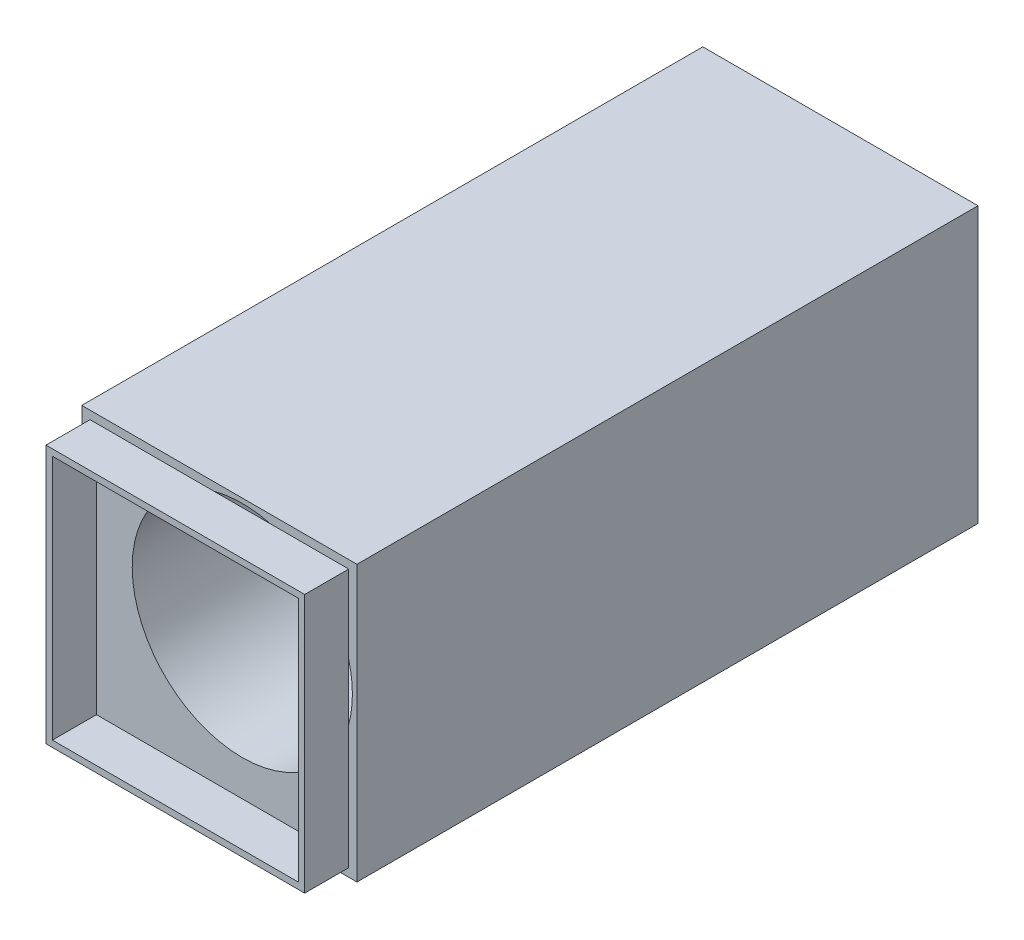
ISO-10303-21;
HEADER;
FILE_DESCRIPTION(('STEP AP214'),'2;1');
FILE_NAME('part.step','',(''),(''),'','','');
FILE_SCHEMA(('AUTOMOTIVE_DESIGN { 1 0 10303 214 1 1 1 1 }'));
ENDSEC;
DATA;
#1=APPLICATION_CONTEXT('core data for automotive mechanical design processes');
#2=APPLICATION_PROTOCOL_DEFINITION('international standard','automotive_design',2000,#1);
#3=PRODUCT_CONTEXT('',#1,'mechanical');
#4=PRODUCT('Part','Part','',(#3));
#5=PRODUCT_RELATED_PRODUCT_CATEGORY('part','',(#4));
#6=PRODUCT_DEFINITION_FORMATION('','',#4);
#7=PRODUCT_DEFINITION_CONTEXT('part definition',#1,'design');
#8=PRODUCT_DEFINITION('design','',#6,#7);
#9=PRODUCT_DEFINITION_SHAPE('','',#8);
#10=(LENGTH_UNIT() NAMED_UNIT(*) SI_UNIT(.MILLI.,.METRE.));
#11=(NAMED_UNIT(*) PLANE_ANGLE_UNIT() SI_UNIT($,.RADIAN.));
#12=(NAMED_UNIT(*) SI_UNIT($,.STERADIAN.) SOLID_ANGLE_UNIT());
#13=UNCERTAINTY_MEASURE_WITH_UNIT(LENGTH_MEASURE(1.E-05),#10,'distance_accuracy_value','');
#14=(GEOMETRIC_REPRESENTATION_CONTEXT(3) GLOBAL_UNCERTAINTY_ASSIGNED_CONTEXT((#13)) GLOBAL_UNIT_ASSIGNED_CONTEXT((#10,
#11,#12)) REPRESENTATION_CONTEXT('',''));
#15=CARTESIAN_POINT('',(0.,0.,0.));
#16=DIRECTION('',(0.,0.,1.));
#17=DIRECTION('',(1.,0.,0.));
#18=AXIS2_PLACEMENT_3D('',#15,#16,#17);
#19=CARTESIAN_POINT('',(0.,0.,-12.192));
#20=DIRECTION('',(0.,0.,1.));
#21=DIRECTION('',(1.,0.,0.));
#22=AXIS2_PLACEMENT_3D('',#19,#20,#21);
#23=PLANE('',#22);
#24=CARTESIAN_POINT('',(44.45,44.45,-12.192));
#25=DIRECTION('',(0.,0.,1.));
#26=DIRECTION('',(1.,0.,0.));
#27=AXIS2_PLACEMENT_3D('',#24,#25,#26);
#28=CIRCLE('',#27,30.48);
#29=CARTESIAN_POINT('',(72.136,57.1981686527908,-12.192));
#30=VERTEX_POINT('',#29);
#31=CARTESIAN_POINT('',(57.1981686527908,72.136,-12.192));
#32=VERTEX_POINT('',#31);
#33=EDGE_CURVE('E183',#30,#32,#28,.T.);
#34=ORIENTED_EDGE('',*,*,#33,.F.);
#35=DIRECTION('',(0.,-1.,0.));
#36=VECTOR('',#35,1.);
#37=CARTESIAN_POINT('',(72.136,0.,-12.192));
#38=LINE('',#37,#36);
#39=CARTESIAN_POINT('',(72.136,72.136,-12.192));
#40=VERTEX_POINT('',#39);
#41=EDGE_CURVE('E257',#40,#30,#38,.T.);
#42=ORIENTED_EDGE('',*,*,#41,.F.);
#43=DIRECTION('',(1.,0.,0.));
#44=VECTOR('',#43,1.);
#45=CARTESIAN_POINT('',(0.,72.136,-12.192));
#46=LINE('',#45,#44);
#47=EDGE_CURVE('E255',#32,#40,#46,.T.);
#48=ORIENTED_EDGE('',*,*,#47,.F.);
#49=EDGE_LOOP('',(#34,#42,#48));
#50=FACE_BOUND('',#49,.T.);
#51=ADVANCED_FACE('F57',(#50),#23,.T.);
#52=CARTESIAN_POINT('',(0.,0.,-184.15));
#53=DIRECTION('',(-1.,0.,0.));
#54=DIRECTION('',(0.,0.,1.));
#55=AXIS2_PLACEMENT_3D('',#52,#53,#54);
#56=PLANE('',#55);
#57=DIRECTION('',(0.,0.,1.));
#58=VECTOR('',#57,1.);
#59=CARTESIAN_POINT('',(0.,0.,-184.15));
#60=LINE('',#59,#58);
#61=CARTESIAN_POINT('',(0.,0.,-184.15));
#62=VERTEX_POINT('',#61);
#63=CARTESIAN_POINT('',(0.,0.,-12.192));
#64=VERTEX_POINT('',#63);
#65=EDGE_CURVE('E492',#62,#64,#60,.T.);
#66=ORIENTED_EDGE('',*,*,#65,.T.);
#67=DIRECTION('',(0.,-1.,0.));
#68=VECTOR('',#67,1.);
#69=CARTESIAN_POINT('',(0.,0.,-12.192));
#70=LINE('',#69,#68);
#71=CARTESIAN_POINT('',(0.,76.2,-12.192));
#72=VERTEX_POINT('',#71);
#73=EDGE_CURVE('E216',#72,#64,#70,.T.);
#74=ORIENTED_EDGE('',*,*,#73,.F.);
#75=DIRECTION('',(0.,0.,1.));
#76=VECTOR('',#75,1.);
#77=CARTESIAN_POINT('',(0.,76.2,-184.15));
#78=LINE('',#77,#76);
#79=CARTESIAN_POINT('',(0.,76.2,-184.15));
#80=VERTEX_POINT('',#79);
#81=EDGE_CURVE('E175',#80,#72,#78,.T.);
#82=ORIENTED_EDGE('',*,*,#81,.F.);
#83=DIRECTION('',(0.,-1.,0.));
#84=VECTOR('',#83,1.);
#85=CARTESIAN_POINT('',(0.,0.,-184.15));
#86=LINE('',#85,#84);
#87=EDGE_CURVE('E479',#80,#62,#86,.T.);
#88=ORIENTED_EDGE('',*,*,#87,.T.);
#89=EDGE_LOOP('',(#66,#74,#82,#88));
#90=FACE_BOUND('',#89,.T.);
#91=ADVANCED_FACE('F59',(#90),#56,.T.);
#92=CARTESIAN_POINT('',(0.,76.2,-184.15));
#93=DIRECTION('',(0.,1.,0.));
#94=DIRECTION('',(0.,0.,1.));
#95=AXIS2_PLACEMENT_3D('',#92,#93,#94);
#96=PLANE('',#95);
#97=ORIENTED_EDGE('',*,*,#81,.T.);
#98=DIRECTION('',(-1.,0.,0.));
#99=VECTOR('',#98,1.);
#100=CARTESIAN_POINT('',(0.,76.2,-12.192));
#101=LINE('',#100,#99);
#102=CARTESIAN_POINT('',(76.2,76.2,-12.192));
#103=VERTEX_POINT('',#102);
#104=EDGE_CURVE('E220',#103,#72,#101,.T.);
#105=ORIENTED_EDGE('',*,*,#104,.F.);
#106=DIRECTION('',(0.,0.,1.));
#107=VECTOR('',#106,1.);
#108=CARTESIAN_POINT('',(76.2,76.2,-184.15));
#109=LINE('',#108,#107);
#110=CARTESIAN_POINT('',(76.2,76.2,-184.15));
#111=VERTEX_POINT('',#110);
#112=EDGE_CURVE('E490',#111,#103,#109,.T.);
#113=ORIENTED_EDGE('',*,*,#112,.F.);
#114=DIRECTION('',(-1.,0.,0.));
#115=VECTOR('',#114,1.);
#116=CARTESIAN_POINT('',(0.,76.2,-184.15));
#117=LINE('',#116,#115);
#118=EDGE_CURVE('E482',#111,#80,#117,.T.);
#119=ORIENTED_EDGE('',*,*,#118,.T.);
#120=EDGE_LOOP('',(#97,#105,#113,#119));
#121=FACE_BOUND('',#120,.T.);
#122=ADVANCED_FACE('F304',(#121),#96,.T.);
#123=CARTESIAN_POINT('',(76.2,0.,-184.15));
#124=DIRECTION('',(1.,0.,0.));
#125=DIRECTION('',(0.,0.,-1.));
#126=AXIS2_PLACEMENT_3D('',#123,#124,#125);
#127=PLANE('',#126);
#128=ORIENTED_EDGE('',*,*,#112,.T.);
#129=DIRECTION('',(0.,1.,0.));
#130=VECTOR('',#129,1.);
#131=CARTESIAN_POINT('',(76.2,0.,-12.192));
#132=LINE('',#131,#130);
#133=CARTESIAN_POINT('',(76.2,0.,-12.192));
#134=VERTEX_POINT('',#133);
#135=EDGE_CURVE('E212',#134,#103,#132,.T.);
#136=ORIENTED_EDGE('',*,*,#135,.F.);
#137=DIRECTION('',(0.,0.,1.));
#138=VECTOR('',#137,1.);
#139=CARTESIAN_POINT('',(76.2,0.,-184.15));
#140=LINE('',#139,#138);
#141=CARTESIAN_POINT('',(76.2,0.,-184.15));
#142=VERTEX_POINT('',#141);
#143=EDGE_CURVE('E495',#142,#134,#140,.T.);
#144=ORIENTED_EDGE('',*,*,#143,.F.);
#145=DIRECTION('',(0.,1.,0.));
#146=VECTOR('',#145,1.);
#147=CARTESIAN_POINT('',(76.2,0.,-184.15));
#148=LINE('',#147,#146);
#149=EDGE_CURVE('E493',#142,#111,#148,.T.);
#150=ORIENTED_EDGE('',*,*,#149,.T.);
#151=EDGE_LOOP('',(#128,#136,#144,#150));
#152=FACE_BOUND('',#151,.T.);
#153=ADVANCED_FACE('F441',(#152),#127,.T.);
#154=CARTESIAN_POINT('',(0.,0.,-184.15));
#155=DIRECTION('',(0.,-1.,0.));
#156=DIRECTION('',(0.,0.,-1.));
#157=AXIS2_PLACEMENT_3D('',#154,#155,#156);
#158=PLANE('',#157);
#159=ORIENTED_EDGE('',*,*,#143,.T.);
#160=DIRECTION('',(1.,0.,0.));
#161=VECTOR('',#160,1.);
#162=CARTESIAN_POINT('',(0.,0.,-12.192));
#163=LINE('',#162,#161);
#164=EDGE_CURVE('E213',#64,#134,#163,.T.);
#165=ORIENTED_EDGE('',*,*,#164,.F.);
#166=ORIENTED_EDGE('',*,*,#65,.F.);
#167=DIRECTION('',(1.,0.,0.));
#168=VECTOR('',#167,1.);
#169=CARTESIAN_POINT('',(0.,0.,-184.15));
#170=LINE('',#169,#168);
#171=EDGE_CURVE('E484',#62,#142,#170,.T.);
#172=ORIENTED_EDGE('',*,*,#171,.T.);
#173=EDGE_LOOP('',(#159,#165,#166,#172));
#174=FACE_BOUND('',#173,.T.);
#175=ADVANCED_FACE('F437',(#174),#158,.T.);
#176=CARTESIAN_POINT('',(0.,0.,-184.15));
#177=DIRECTION('',(0.,0.,-1.));
#178=DIRECTION('',(-1.,0.,0.));
#179=AXIS2_PLACEMENT_3D('',#176,#177,#178);
#180=PLANE('',#179);
#181=ORIENTED_EDGE('',*,*,#87,.F.);
#182=ORIENTED_EDGE('',*,*,#118,.F.);
#183=ORIENTED_EDGE('',*,*,#149,.F.);
#184=ORIENTED_EDGE('',*,*,#171,.F.);
#185=EDGE_LOOP('',(#181,#182,#183,#184));
#186=FACE_BOUND('',#185,.T.);
#187=ADVANCED_FACE('F391',(#186),#180,.T.);
#188=CARTESIAN_POINT('',(0.,73.914,-12.192));
#189=DIRECTION('',(0.,-1.,0.));
#190=DIRECTION('',(0.,0.,-1.));
#191=AXIS2_PLACEMENT_3D('',#188,#189,#190);
#192=PLANE('',#191);
#193=DIRECTION('',(1.,0.,0.));
#194=VECTOR('',#193,1.);
#195=CARTESIAN_POINT('',(0.,73.914,0.));
#196=LINE('',#195,#194);
#197=CARTESIAN_POINT('',(2.286,73.914,0.));
#198=VERTEX_POINT('',#197);
#199=CARTESIAN_POINT('',(73.914,73.914,0.));
#200=VERTEX_POINT('',#199);
#201=EDGE_CURVE('E233',#198,#200,#196,.T.);
#202=ORIENTED_EDGE('',*,*,#201,.T.);
#203=DIRECTION('',(0.,0.,1.));
#204=VECTOR('',#203,1.);
#205=CARTESIAN_POINT('',(73.914,73.914,-12.192));
#206=LINE('',#205,#204);
#207=CARTESIAN_POINT('',(73.914,73.914,-12.192));
#208=VERTEX_POINT('',#207);
#209=EDGE_CURVE('E504',#208,#200,#206,.T.);
#210=ORIENTED_EDGE('',*,*,#209,.F.);
#211=DIRECTION('',(1.,0.,0.));
#212=VECTOR('',#211,1.);
#213=CARTESIAN_POINT('',(0.,73.914,-12.192));
#214=LINE('',#213,#212);
#215=CARTESIAN_POINT('',(52.2540440798344,73.914,-12.192));
#216=VERTEX_POINT('',#215);
#217=EDGE_CURVE('E198',#216,#208,#214,.T.);
#218=ORIENTED_EDGE('',*,*,#217,.F.);
#219=CARTESIAN_POINT('',(36.6459559201656,73.914,-12.192));
#220=VERTEX_POINT('',#219);
#221=EDGE_CURVE('E207',#220,#216,#214,.T.);
#222=ORIENTED_EDGE('',*,*,#221,.F.);
#223=CARTESIAN_POINT('',(2.286,73.914,-12.192));
#224=VERTEX_POINT('',#223);
#225=EDGE_CURVE('E205',#224,#220,#214,.T.);
#226=ORIENTED_EDGE('',*,*,#225,.F.);
#227=DIRECTION('',(0.,0.,1.));
#228=VECTOR('',#227,1.);
#229=CARTESIAN_POINT('',(2.286,73.914,-12.192));
#230=LINE('',#229,#228);
#231=EDGE_CURVE('E486',#224,#198,#230,.T.);
#232=ORIENTED_EDGE('',*,*,#231,.T.);
#233=EDGE_LOOP('',(#202,#210,#218,#222,#226,#232));
#234=FACE_BOUND('',#233,.T.);
#235=ADVANCED_FACE('F386',(#234),#192,.F.);
#236=CARTESIAN_POINT('',(2.28600000000001,0.,-12.192));
#237=DIRECTION('',(-1.,0.,0.));
#238=DIRECTION('',(0.,-1.,0.));
#239=AXIS2_PLACEMENT_3D('',#236,#237,#238);
#240=PLANE('',#239);
#241=DIRECTION('',(0.,-1.,0.));
#242=VECTOR('',#241,1.);
#243=CARTESIAN_POINT('',(2.28600000000001,0.,0.));
#244=LINE('',#243,#242);
#245=CARTESIAN_POINT('',(2.28600000000001,2.286,0.));
#246=VERTEX_POINT('',#245);
#247=EDGE_CURVE('E222',#198,#246,#244,.T.);
#248=ORIENTED_EDGE('',*,*,#247,.F.);
#249=ORIENTED_EDGE('',*,*,#231,.F.);
#250=DIRECTION('',(0.,-1.,0.));
#251=VECTOR('',#250,1.);
#252=CARTESIAN_POINT('',(2.28600000000001,0.,-12.192));
#253=LINE('',#252,#251);
#254=CARTESIAN_POINT('',(2.28600000000001,2.286,-12.192));
#255=VERTEX_POINT('',#254);
#256=EDGE_CURVE('E202',#224,#255,#253,.T.);
#257=ORIENTED_EDGE('',*,*,#256,.T.);
#258=DIRECTION('',(0.,0.,1.));
#259=VECTOR('',#258,1.);
#260=CARTESIAN_POINT('',(2.28600000000001,2.286,-12.192));
#261=LINE('',#260,#259);
#262=EDGE_CURVE('E508',#255,#246,#261,.T.);
#263=ORIENTED_EDGE('',*,*,#262,.T.);
#264=EDGE_LOOP('',(#248,#249,#257,#263));
#265=FACE_BOUND('',#264,.T.);
#266=ADVANCED_FACE('F390',(#265),#240,.T.);
#267=CARTESIAN_POINT('',(0.,2.286,-12.192));
#268=DIRECTION('',(0.,-1.,0.));
#269=DIRECTION('',(1.,0.,0.));
#270=AXIS2_PLACEMENT_3D('',#267,#268,#269);
#271=PLANE('',#270);
#272=DIRECTION('',(1.,0.,0.));
#273=VECTOR('',#272,1.);
#274=CARTESIAN_POINT('',(0.,2.286,0.));
#275=LINE('',#274,#273);
#276=CARTESIAN_POINT('',(73.914,2.286,0.));
#277=VERTEX_POINT('',#276);
#278=EDGE_CURVE('E514',#246,#277,#275,.T.);
#279=ORIENTED_EDGE('',*,*,#278,.F.);
#280=ORIENTED_EDGE('',*,*,#262,.F.);
#281=DIRECTION('',(1.,0.,0.));
#282=VECTOR('',#281,1.);
#283=CARTESIAN_POINT('',(0.,2.286,-12.192));
#284=LINE('',#283,#282);
#285=CARTESIAN_POINT('',(73.914,2.286,-12.192));
#286=VERTEX_POINT('',#285);
#287=EDGE_CURVE('E200',#255,#286,#284,.T.);
#288=ORIENTED_EDGE('',*,*,#287,.T.);
#289=DIRECTION('',(0.,0.,1.));
#290=VECTOR('',#289,1.);
#291=CARTESIAN_POINT('',(73.914,2.286,-12.192));
#292=LINE('',#291,#290);
#293=EDGE_CURVE('E506',#286,#277,#292,.T.);
#294=ORIENTED_EDGE('',*,*,#293,.T.);
#295=EDGE_LOOP('',(#279,#280,#288,#294));
#296=FACE_BOUND('',#295,.T.);
#297=ADVANCED_FACE('F379',(#296),#271,.T.);
#298=CARTESIAN_POINT('',(73.914,0.,-12.192));
#299=DIRECTION('',(-1.,0.,0.));
#300=DIRECTION('',(0.,-1.,0.));
#301=AXIS2_PLACEMENT_3D('',#298,#299,#300);
#302=PLANE('',#301);
#303=DIRECTION('',(0.,-1.,0.));
#304=VECTOR('',#303,1.);
#305=CARTESIAN_POINT('',(73.914,0.,0.));
#306=LINE('',#305,#304);
#307=EDGE_CURVE('E517',#200,#277,#306,.T.);
#308=ORIENTED_EDGE('',*,*,#307,.T.);
#309=ORIENTED_EDGE('',*,*,#293,.F.);
#310=DIRECTION('',(0.,-1.,0.));
#311=VECTOR('',#310,1.);
#312=CARTESIAN_POINT('',(73.914,0.,-12.192));
#313=LINE('',#312,#311);
#314=CARTESIAN_POINT('',(73.914,36.6459559201656,-12.192));
#315=VERTEX_POINT('',#314);
#316=EDGE_CURVE('E192',#315,#286,#313,.T.);
#317=ORIENTED_EDGE('',*,*,#316,.F.);
#318=CARTESIAN_POINT('',(73.914,52.2540440798344,-12.192));
#319=VERTEX_POINT('',#318);
#320=EDGE_CURVE('E179',#319,#315,#313,.T.);
#321=ORIENTED_EDGE('',*,*,#320,.F.);
#322=EDGE_CURVE('E190',#208,#319,#313,.T.);
#323=ORIENTED_EDGE('',*,*,#322,.F.);
#324=ORIENTED_EDGE('',*,*,#209,.T.);
#325=EDGE_LOOP('',(#308,#309,#317,#321,#323,#324));
#326=FACE_BOUND('',#325,.T.);
#327=ADVANCED_FACE('F188',(#326),#302,.F.);
#328=CARTESIAN_POINT('',(0.,0.,-12.192));
#329=DIRECTION('',(0.,0.,1.));
#330=DIRECTION('',(1.,0.,0.));
#331=AXIS2_PLACEMENT_3D('',#328,#329,#330);
#332=PLANE('',#331);
#333=CARTESIAN_POINT('',(44.45,44.45,-12.192));
#334=DIRECTION('',(0.,0.,1.));
#335=DIRECTION('',(1.,0.,0.));
#336=AXIS2_PLACEMENT_3D('',#333,#334,#335);
#337=CIRCLE('',#336,30.48);
#338=EDGE_CURVE('E12',#216,#220,#337,.T.);
#339=ORIENTED_EDGE('',*,*,#338,.F.);
#340=ORIENTED_EDGE('',*,*,#217,.T.);
#341=ORIENTED_EDGE('',*,*,#322,.T.);
#342=EDGE_CURVE('E61',#315,#319,#337,.T.);
#343=ORIENTED_EDGE('',*,*,#342,.F.);
#344=ORIENTED_EDGE('',*,*,#316,.T.);
#345=ORIENTED_EDGE('',*,*,#287,.F.);
#346=ORIENTED_EDGE('',*,*,#256,.F.);
#347=ORIENTED_EDGE('',*,*,#225,.T.);
#348=EDGE_LOOP('',(#339,#340,#341,#343,#344,#345,#346,#347));
#349=FACE_BOUND('',#348,.T.);
#350=ORIENTED_EDGE('',*,*,#104,.T.);
#351=ORIENTED_EDGE('',*,*,#73,.T.);
#352=ORIENTED_EDGE('',*,*,#164,.T.);
#353=ORIENTED_EDGE('',*,*,#135,.T.);
#354=EDGE_LOOP('',(#350,#351,#352,#353));
#355=FACE_BOUND('',#354,.T.);
#356=ADVANCED_FACE('F195',(#349,#355),#332,.T.);
#357=CARTESIAN_POINT('',(0.,0.,0.));
#358=DIRECTION('',(0.,0.,-1.));
#359=DIRECTION('',(-1.,0.,0.));
#360=AXIS2_PLACEMENT_3D('',#357,#358,#359);
#361=PLANE('',#360);
#362=ORIENTED_EDGE('',*,*,#307,.F.);
#363=ORIENTED_EDGE('',*,*,#201,.F.);
#364=ORIENTED_EDGE('',*,*,#247,.T.);
#365=ORIENTED_EDGE('',*,*,#278,.T.);
#366=EDGE_LOOP('',(#362,#363,#364,#365));
#367=FACE_BOUND('',#366,.T.);
#368=DIRECTION('',(0.,-1.,0.));
#369=VECTOR('',#368,1.);
#370=CARTESIAN_POINT('',(72.136,0.,0.));
#371=LINE('',#370,#369);
#372=CARTESIAN_POINT('',(72.136,72.136,0.));
#373=VERTEX_POINT('',#372);
#374=CARTESIAN_POINT('',(72.136,4.064,0.));
#375=VERTEX_POINT('',#374);
#376=EDGE_CURVE('E244',#373,#375,#371,.T.);
#377=ORIENTED_EDGE('',*,*,#376,.T.);
#378=DIRECTION('',(1.,0.,0.));
#379=VECTOR('',#378,1.);
#380=CARTESIAN_POINT('',(0.,4.064,0.));
#381=LINE('',#380,#379);
#382=CARTESIAN_POINT('',(4.06400000000001,4.064,0.));
#383=VERTEX_POINT('',#382);
#384=EDGE_CURVE('E234',#383,#375,#381,.T.);
#385=ORIENTED_EDGE('',*,*,#384,.F.);
#386=DIRECTION('',(0.,-1.,0.));
#387=VECTOR('',#386,1.);
#388=CARTESIAN_POINT('',(4.06400000000001,0.,0.));
#389=LINE('',#388,#387);
#390=CARTESIAN_POINT('',(4.064,72.136,0.));
#391=VERTEX_POINT('',#390);
#392=EDGE_CURVE('E238',#391,#383,#389,.T.);
#393=ORIENTED_EDGE('',*,*,#392,.F.);
#394=DIRECTION('',(1.,0.,0.));
#395=VECTOR('',#394,1.);
#396=CARTESIAN_POINT('',(0.,72.136,0.));
#397=LINE('',#396,#395);
#398=EDGE_CURVE('E241',#391,#373,#397,.T.);
#399=ORIENTED_EDGE('',*,*,#398,.T.);
#400=EDGE_LOOP('',(#377,#385,#393,#399));
#401=FACE_BOUND('',#400,.T.);
#402=ADVANCED_FACE('F287',(#367,#401),#361,.F.);
#403=CARTESIAN_POINT('',(72.136,0.,-12.192));
#404=DIRECTION('',(-1.,0.,0.));
#405=DIRECTION('',(0.,-1.,0.));
#406=AXIS2_PLACEMENT_3D('',#403,#404,#405);
#407=PLANE('',#406);
#408=ORIENTED_EDGE('',*,*,#376,.F.);
#409=DIRECTION('',(0.,0.,1.));
#410=VECTOR('',#409,1.);
#411=CARTESIAN_POINT('',(72.136,72.136,-12.192));
#412=LINE('',#411,#410);
#413=EDGE_CURVE('E223',#40,#373,#412,.T.);
#414=ORIENTED_EDGE('',*,*,#413,.F.);
#415=ORIENTED_EDGE('',*,*,#41,.T.);
#416=CARTESIAN_POINT('',(72.136,31.7018313472092,-12.192));
#417=VERTEX_POINT('',#416);
#418=EDGE_CURVE('E181',#30,#417,#38,.T.);
#419=ORIENTED_EDGE('',*,*,#418,.T.);
#420=CARTESIAN_POINT('',(72.136,4.064,-12.192));
#421=VERTEX_POINT('',#420);
#422=EDGE_CURVE('E237',#417,#421,#38,.T.);
#423=ORIENTED_EDGE('',*,*,#422,.T.);
#424=DIRECTION('',(0.,0.,1.));
#425=VECTOR('',#424,1.);
#426=CARTESIAN_POINT('',(72.136,4.064,-12.192));
#427=LINE('',#426,#425);
#428=EDGE_CURVE('E231',#421,#375,#427,.T.);
#429=ORIENTED_EDGE('',*,*,#428,.T.);
#430=EDGE_LOOP('',(#408,#414,#415,#419,#423,#429));
#431=FACE_BOUND('',#430,.T.);
#432=ADVANCED_FACE('F272',(#431),#407,.T.);
#433=CARTESIAN_POINT('',(0.,4.064,-12.192));
#434=DIRECTION('',(0.,-1.,0.));
#435=DIRECTION('',(1.,0.,0.));
#436=AXIS2_PLACEMENT_3D('',#433,#434,#435);
#437=PLANE('',#436);
#438=ORIENTED_EDGE('',*,*,#384,.T.);
#439=ORIENTED_EDGE('',*,*,#428,.F.);
#440=DIRECTION('',(1.,0.,0.));
#441=VECTOR('',#440,1.);
#442=CARTESIAN_POINT('',(0.,4.064,-12.192));
#443=LINE('',#442,#441);
#444=CARTESIAN_POINT('',(4.06400000000001,4.064,-12.192));
#445=VERTEX_POINT('',#444);
#446=EDGE_CURVE('E227',#445,#421,#443,.T.);
#447=ORIENTED_EDGE('',*,*,#446,.F.);
#448=DIRECTION('',(0.,0.,1.));
#449=VECTOR('',#448,1.);
#450=CARTESIAN_POINT('',(4.06400000000001,4.064,-12.192));
#451=LINE('',#450,#449);
#452=EDGE_CURVE('E229',#445,#383,#451,.T.);
#453=ORIENTED_EDGE('',*,*,#452,.T.);
#454=EDGE_LOOP('',(#438,#439,#447,#453));
#455=FACE_BOUND('',#454,.T.);
#456=ADVANCED_FACE('F283',(#455),#437,.F.);
#457=CARTESIAN_POINT('',(4.06400000000001,0.,-12.192));
#458=DIRECTION('',(-1.,0.,0.));
#459=DIRECTION('',(0.,-1.,0.));
#460=AXIS2_PLACEMENT_3D('',#457,#458,#459);
#461=PLANE('',#460);
#462=ORIENTED_EDGE('',*,*,#392,.T.);
#463=ORIENTED_EDGE('',*,*,#452,.F.);
#464=DIRECTION('',(0.,-1.,0.));
#465=VECTOR('',#464,1.);
#466=CARTESIAN_POINT('',(4.06400000000001,0.,-12.192));
#467=LINE('',#466,#465);
#468=CARTESIAN_POINT('',(4.064,72.136,-12.192));
#469=VERTEX_POINT('',#468);
#470=EDGE_CURVE('E249',#469,#445,#467,.T.);
#471=ORIENTED_EDGE('',*,*,#470,.F.);
#472=DIRECTION('',(0.,0.,1.));
#473=VECTOR('',#472,1.);
#474=CARTESIAN_POINT('',(4.064,72.136,-12.192));
#475=LINE('',#474,#473);
#476=EDGE_CURVE('E226',#469,#391,#475,.T.);
#477=ORIENTED_EDGE('',*,*,#476,.T.);
#478=EDGE_LOOP('',(#462,#463,#471,#477));
#479=FACE_BOUND('',#478,.T.);
#480=ADVANCED_FACE('F290',(#479),#461,.F.);
#481=CARTESIAN_POINT('',(0.,72.136,-12.192));
#482=DIRECTION('',(0.,-1.,0.));
#483=DIRECTION('',(0.,0.,-1.));
#484=AXIS2_PLACEMENT_3D('',#481,#482,#483);
#485=PLANE('',#484);
#486=ORIENTED_EDGE('',*,*,#398,.F.);
#487=ORIENTED_EDGE('',*,*,#476,.F.);
#488=CARTESIAN_POINT('',(31.7018313472092,72.136,-12.192));
#489=VERTEX_POINT('',#488);
#490=EDGE_CURVE('E252',#469,#489,#46,.T.);
#491=ORIENTED_EDGE('',*,*,#490,.T.);
#492=EDGE_CURVE('E256',#489,#32,#46,.T.);
#493=ORIENTED_EDGE('',*,*,#492,.T.);
#494=ORIENTED_EDGE('',*,*,#47,.T.);
#495=ORIENTED_EDGE('',*,*,#413,.T.);
#496=EDGE_LOOP('',(#486,#487,#491,#493,#494,#495));
#497=FACE_BOUND('',#496,.T.);
#498=ADVANCED_FACE('F268',(#497),#485,.T.);
#499=EDGE_CURVE('E274',#489,#417,#28,.T.);
#500=ORIENTED_EDGE('',*,*,#499,.F.);
#501=ORIENTED_EDGE('',*,*,#490,.F.);
#502=ORIENTED_EDGE('',*,*,#470,.T.);
#503=ORIENTED_EDGE('',*,*,#446,.T.);
#504=ORIENTED_EDGE('',*,*,#422,.F.);
#505=EDGE_LOOP('',(#500,#501,#502,#503,#504));
#506=FACE_BOUND('',#505,.T.);
#507=ADVANCED_FACE('F279',(#506),#23,.T.);
#508=CARTESIAN_POINT('',(44.45,44.45,-12.192));
#509=DIRECTION('',(0.,0.,1.));
#510=DIRECTION('',(1.,0.,0.));
#511=AXIS2_PLACEMENT_3D('',#508,#509,#510);
#512=PLANE('',#511);
#513=EDGE_CURVE('E170',#319,#30,#28,.T.);
#514=ORIENTED_EDGE('',*,*,#513,.F.);
#515=ORIENTED_EDGE('',*,*,#320,.T.);
#516=EDGE_CURVE('E77',#417,#315,#28,.T.);
#517=ORIENTED_EDGE('',*,*,#516,.F.);
#518=ORIENTED_EDGE('',*,*,#418,.F.);
#519=EDGE_LOOP('',(#514,#515,#517,#518));
#520=FACE_BOUND('',#519,.T.);
#521=ADVANCED_FACE('F178',(#520),#512,.F.);
#522=EDGE_CURVE('E71',#220,#489,#28,.T.);
#523=ORIENTED_EDGE('',*,*,#522,.F.);
#524=ORIENTED_EDGE('',*,*,#221,.T.);
#525=EDGE_CURVE('E273',#32,#216,#28,.T.);
#526=ORIENTED_EDGE('',*,*,#525,.F.);
#527=ORIENTED_EDGE('',*,*,#492,.F.);
#528=EDGE_LOOP('',(#523,#524,#526,#527));
#529=FACE_BOUND('',#528,.T.);
#530=ADVANCED_FACE('F311',(#529),#512,.F.);
#531=CARTESIAN_POINT('',(44.45,44.45,-177.292));
#532=DIRECTION('',(0.,0.,1.));
#533=DIRECTION('',(1.,0.,0.));
#534=AXIS2_PLACEMENT_3D('',#531,#532,#533);
#535=CYLINDRICAL_SURFACE('',#534,30.48);
#536=CARTESIAN_POINT('',(44.45,44.45,-177.292));
#537=DIRECTION('',(0.,0.,1.));
#538=DIRECTION('',(1.,0.,0.));
#539=AXIS2_PLACEMENT_3D('',#536,#537,#538);
#540=CIRCLE('',#539,30.48);
#541=CARTESIAN_POINT('',(74.93,44.45,-177.292));
#542=VERTEX_POINT('',#541);
#543=EDGE_CURVE('E182',#542,#542,#540,.T.);
#544=ORIENTED_EDGE('',*,*,#543,.F.);
#545=EDGE_LOOP('',(#544));
#546=FACE_BOUND('',#545,.T.);
#547=ORIENTED_EDGE('',*,*,#513,.T.);
#548=ORIENTED_EDGE('',*,*,#33,.T.);
#549=ORIENTED_EDGE('',*,*,#525,.T.);
#550=ORIENTED_EDGE('',*,*,#338,.T.);
#551=ORIENTED_EDGE('',*,*,#522,.T.);
#552=ORIENTED_EDGE('',*,*,#499,.T.);
#553=ORIENTED_EDGE('',*,*,#516,.T.);
#554=ORIENTED_EDGE('',*,*,#342,.T.);
#555=EDGE_LOOP('',(#547,#548,#549,#550,#551,#552,#553,#554));
#556=FACE_BOUND('',#555,.T.);
#557=ADVANCED_FACE('F168',(#546,#556),#535,.F.);
#558=CARTESIAN_POINT('',(44.45,44.45,-177.292));
#559=DIRECTION('',(0.,0.,1.));
#560=DIRECTION('',(1.,0.,0.));
#561=AXIS2_PLACEMENT_3D('',#558,#559,#560);
#562=PLANE('',#561);
#563=ORIENTED_EDGE('',*,*,#543,.T.);
#564=EDGE_LOOP('',(#563));
#565=FACE_BOUND('',#564,.T.);
#566=ADVANCED_FACE('F318',(#565),#562,.T.);
#567=CLOSED_SHELL('',(#51,#91,#122,#153,#175,#187,#235,#266,#297,#327,#356,#402,#432,#456,#480,
#498,#507,#521,#530,#557,#566));
#568=MANIFOLD_SOLID_BREP('B2',#567);
#569=ADVANCED_BREP_SHAPE_REPRESENTATION('',(#18,#568),#14);
#570=SHAPE_DEFINITION_REPRESENTATION(#9,#569);
ENDSEC;
END-ISO-10303-21;
